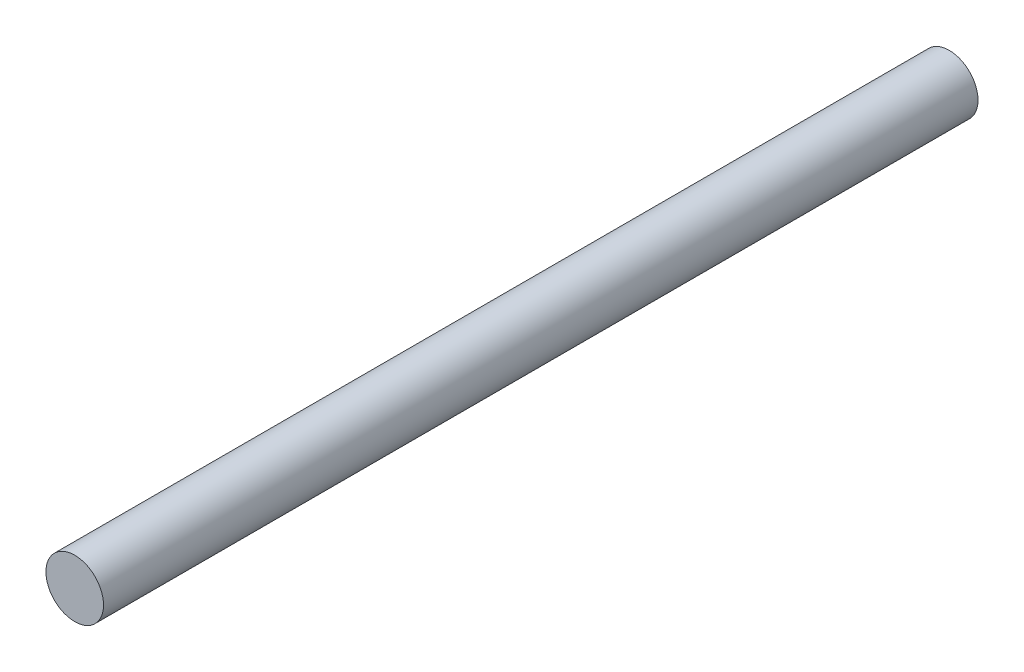
ISO-10303-21;
HEADER;
FILE_DESCRIPTION(('STEP AP214'),'2;1');
FILE_NAME('part.step','',(''),(''),'','','');
FILE_SCHEMA(('AUTOMOTIVE_DESIGN { 1 0 10303 214 1 1 1 1 }'));
ENDSEC;
DATA;
#1=APPLICATION_CONTEXT('core data for automotive mechanical design processes');
#2=APPLICATION_PROTOCOL_DEFINITION('international standard','automotive_design',2000,#1);
#3=PRODUCT_CONTEXT('',#1,'mechanical');
#4=PRODUCT('Part','Part','',(#3));
#5=PRODUCT_RELATED_PRODUCT_CATEGORY('part','',(#4));
#6=PRODUCT_DEFINITION_FORMATION('','',#4);
#7=PRODUCT_DEFINITION_CONTEXT('part definition',#1,'design');
#8=PRODUCT_DEFINITION('design','',#6,#7);
#9=PRODUCT_DEFINITION_SHAPE('','',#8);
#10=(LENGTH_UNIT() NAMED_UNIT(*) SI_UNIT(.MILLI.,.METRE.));
#11=(NAMED_UNIT(*) PLANE_ANGLE_UNIT() SI_UNIT($,.RADIAN.));
#12=(NAMED_UNIT(*) SI_UNIT($,.STERADIAN.) SOLID_ANGLE_UNIT());
#13=UNCERTAINTY_MEASURE_WITH_UNIT(LENGTH_MEASURE(1.E-05),#10,'distance_accuracy_value','');
#14=(GEOMETRIC_REPRESENTATION_CONTEXT(3) GLOBAL_UNCERTAINTY_ASSIGNED_CONTEXT((#13)) GLOBAL_UNIT_ASSIGNED_CONTEXT((#10,
#11,#12)) REPRESENTATION_CONTEXT('',''));
#15=CARTESIAN_POINT('',(0.,0.,0.));
#16=DIRECTION('',(0.,0.,1.));
#17=DIRECTION('',(1.,0.,0.));
#18=AXIS2_PLACEMENT_3D('',#15,#16,#17);
#19=CARTESIAN_POINT('',(0.,0.,120.));
#20=DIRECTION('',(0.,0.,-1.));
#21=DIRECTION('',(-1.,0.,0.));
#22=AXIS2_PLACEMENT_3D('',#19,#20,#21);
#23=CYLINDRICAL_SURFACE('',#22,3.95);
#24=CARTESIAN_POINT('',(0.,0.,120.));
#25=DIRECTION('',(0.,0.,1.));
#26=DIRECTION('',(1.,0.,0.));
#27=AXIS2_PLACEMENT_3D('',#24,#25,#26);
#28=CIRCLE('',#27,3.95);
#29=CARTESIAN_POINT('',(3.95,0.,120.));
#30=VERTEX_POINT('',#29);
#31=EDGE_CURVE('E10',#30,#30,#28,.T.);
#32=ORIENTED_EDGE('',*,*,#31,.F.);
#33=EDGE_LOOP('',(#32));
#34=FACE_BOUND('',#33,.T.);
#35=CARTESIAN_POINT('',(0.,0.,0.));
#36=DIRECTION('',(0.,0.,1.));
#37=DIRECTION('',(1.,0.,0.));
#38=AXIS2_PLACEMENT_3D('',#35,#36,#37);
#39=CIRCLE('',#38,3.95);
#40=CARTESIAN_POINT('',(3.95,0.,0.));
#41=VERTEX_POINT('',#40);
#42=EDGE_CURVE('E36',#41,#41,#39,.T.);
#43=ORIENTED_EDGE('',*,*,#42,.T.);
#44=EDGE_LOOP('',(#43));
#45=FACE_BOUND('',#44,.T.);
#46=ADVANCED_FACE('F33',(#34,#45),#23,.T.);
#47=CARTESIAN_POINT('',(0.,0.,120.));
#48=DIRECTION('',(0.,0.,1.));
#49=DIRECTION('',(1.,0.,0.));
#50=AXIS2_PLACEMENT_3D('',#47,#48,#49);
#51=PLANE('',#50);
#52=ORIENTED_EDGE('',*,*,#31,.T.);
#53=EDGE_LOOP('',(#52));
#54=FACE_BOUND('',#53,.T.);
#55=ADVANCED_FACE('F48',(#54),#51,.T.);
#56=CARTESIAN_POINT('',(0.,0.,0.));
#57=DIRECTION('',(0.,0.,1.));
#58=DIRECTION('',(1.,0.,0.));
#59=AXIS2_PLACEMENT_3D('',#56,#57,#58);
#60=PLANE('',#59);
#61=ORIENTED_EDGE('',*,*,#42,.F.);
#62=EDGE_LOOP('',(#61));
#63=FACE_BOUND('',#62,.T.);
#64=ADVANCED_FACE('F46',(#63),#60,.F.);
#65=CLOSED_SHELL('',(#46,#55,#64));
#66=MANIFOLD_SOLID_BREP('B2',#65);
#67=ADVANCED_BREP_SHAPE_REPRESENTATION('',(#18,#66),#14);
#68=SHAPE_DEFINITION_REPRESENTATION(#9,#67);
ENDSEC;
END-ISO-10303-21;
